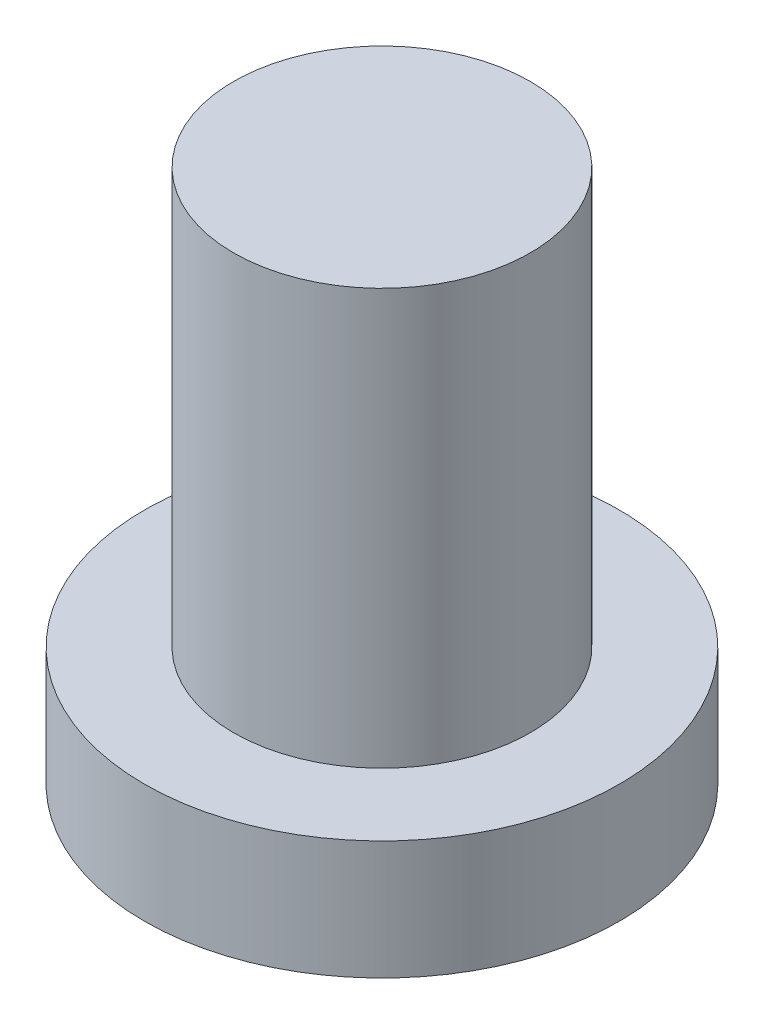
ISO-10303-21;
HEADER;
FILE_DESCRIPTION(('STEP AP214'),'2;1');
FILE_NAME('part.step','',(''),(''),'','','');
FILE_SCHEMA(('AUTOMOTIVE_DESIGN { 1 0 10303 214 1 1 1 1 }'));
ENDSEC;
DATA;
#1=APPLICATION_CONTEXT('core data for automotive mechanical design processes');
#2=APPLICATION_PROTOCOL_DEFINITION('international standard','automotive_design',2000,#1);
#3=PRODUCT_CONTEXT('',#1,'mechanical');
#4=PRODUCT('Part','Part','',(#3));
#5=PRODUCT_RELATED_PRODUCT_CATEGORY('part','',(#4));
#6=PRODUCT_DEFINITION_FORMATION('','',#4);
#7=PRODUCT_DEFINITION_CONTEXT('part definition',#1,'design');
#8=PRODUCT_DEFINITION('design','',#6,#7);
#9=PRODUCT_DEFINITION_SHAPE('','',#8);
#10=(LENGTH_UNIT() NAMED_UNIT(*) SI_UNIT(.MILLI.,.METRE.));
#11=(NAMED_UNIT(*) PLANE_ANGLE_UNIT() SI_UNIT($,.RADIAN.));
#12=(NAMED_UNIT(*) SI_UNIT($,.STERADIAN.) SOLID_ANGLE_UNIT());
#13=UNCERTAINTY_MEASURE_WITH_UNIT(LENGTH_MEASURE(1.E-05),#10,'distance_accuracy_value','');
#14=(GEOMETRIC_REPRESENTATION_CONTEXT(3) GLOBAL_UNCERTAINTY_ASSIGNED_CONTEXT((#13)) GLOBAL_UNIT_ASSIGNED_CONTEXT((#10,
#11,#12)) REPRESENTATION_CONTEXT('',''));
#15=CARTESIAN_POINT('',(0.,0.,0.));
#16=DIRECTION('',(0.,0.,1.));
#17=DIRECTION('',(1.,0.,0.));
#18=AXIS2_PLACEMENT_3D('',#15,#16,#17);
#19=CARTESIAN_POINT('',(2136.0000000012,625.499975958724,742.5));
#20=DIRECTION('',(0.,1.,1.60365119622746E-13));
#21=DIRECTION('',(0.,-1.60365119622746E-13,1.));
#22=AXIS2_PLACEMENT_3D('',#19,#20,#21);
#23=CYLINDRICAL_SURFACE('',#22,3.99999999881961);
#24=CARTESIAN_POINT('',(2136.0000000012,625.499987979711,742.5));
#25=DIRECTION('',(0.,1.,1.60365119622746E-13));
#26=DIRECTION('',(0.,-1.60365119622746E-13,1.));
#27=AXIS2_PLACEMENT_3D('',#24,#25,#26);
#28=CIRCLE('',#27,3.99999999881961);
#29=CARTESIAN_POINT('',(2136.0000000012,625.49998797971,746.49999999882));
#30=VERTEX_POINT('',#29);
#31=EDGE_CURVE('E43',#30,#30,#28,.T.);
#32=ORIENTED_EDGE('',*,*,#31,.T.);
#33=EDGE_LOOP('',(#32));
#34=FACE_BOUND('',#33,.T.);
#35=CARTESIAN_POINT('',(2136.0000000012,627.499987979723,742.5));
#36=DIRECTION('',(0.,1.,1.60365119622746E-13));
#37=DIRECTION('',(0.,-1.60365119622746E-13,1.));
#38=AXIS2_PLACEMENT_3D('',#35,#36,#37);
#39=CIRCLE('',#38,3.99999999881961);
#40=CARTESIAN_POINT('',(2136.0000000012,627.499987979722,746.49999999882));
#41=VERTEX_POINT('',#40);
#42=EDGE_CURVE('E10',#41,#41,#39,.T.);
#43=ORIENTED_EDGE('',*,*,#42,.F.);
#44=EDGE_LOOP('',(#43));
#45=FACE_BOUND('',#44,.T.);
#46=ADVANCED_FACE('F29',(#34,#45),#23,.T.);
#47=CARTESIAN_POINT('',(2138.5000000012,627.499987979723,742.5));
#48=DIRECTION('',(0.,1.,1.60365119622746E-13));
#49=DIRECTION('',(0.,-1.60365119622746E-13,1.));
#50=AXIS2_PLACEMENT_3D('',#47,#48,#49);
#51=PLANE('',#50);
#52=ORIENTED_EDGE('',*,*,#42,.T.);
#53=EDGE_LOOP('',(#52));
#54=FACE_BOUND('',#53,.T.);
#55=CARTESIAN_POINT('',(2136.0000000012,627.499987979723,742.5));
#56=DIRECTION('',(0.,1.,1.60365119622746E-13));
#57=DIRECTION('',(0.,-1.60365119622746E-13,1.));
#58=AXIS2_PLACEMENT_3D('',#55,#56,#57);
#59=CIRCLE('',#58,2.50000000000039);
#60=CARTESIAN_POINT('',(2136.0000000012,627.499987979722,745.000000000001));
#61=VERTEX_POINT('',#60);
#62=EDGE_CURVE('E35',#61,#61,#59,.T.);
#63=ORIENTED_EDGE('',*,*,#62,.F.);
#64=EDGE_LOOP('',(#63));
#65=FACE_BOUND('',#64,.T.);
#66=ADVANCED_FACE('F62',(#54,#65),#51,.T.);
#67=CARTESIAN_POINT('',(2136.0000000012,625.499975958724,742.5));
#68=DIRECTION('',(0.,1.,1.60365119622746E-13));
#69=DIRECTION('',(0.,-1.60365119622746E-13,1.));
#70=AXIS2_PLACEMENT_3D('',#67,#68,#69);
#71=CYLINDRICAL_SURFACE('',#70,2.50000000000039);
#72=ORIENTED_EDGE('',*,*,#62,.T.);
#73=EDGE_LOOP('',(#72));
#74=FACE_BOUND('',#73,.T.);
#75=CARTESIAN_POINT('',(2136.0000000012,634.499987979581,742.500000000002));
#76=DIRECTION('',(0.,1.,1.60365119622746E-13));
#77=DIRECTION('',(0.,-1.60365119622746E-13,1.));
#78=AXIS2_PLACEMENT_3D('',#75,#76,#77);
#79=CIRCLE('',#78,2.50000000000039);
#80=CARTESIAN_POINT('',(2136.0000000012,634.499987979581,745.000000000002));
#81=VERTEX_POINT('',#80);
#82=EDGE_CURVE('E39',#81,#81,#79,.T.);
#83=ORIENTED_EDGE('',*,*,#82,.F.);
#84=EDGE_LOOP('',(#83));
#85=FACE_BOUND('',#84,.T.);
#86=ADVANCED_FACE('F58',(#74,#85),#71,.T.);
#87=CARTESIAN_POINT('',(2136.0000000012,634.499987979581,742.500000000002));
#88=DIRECTION('',(0.,1.,1.60365119622746E-13));
#89=DIRECTION('',(0.,-1.60365119622746E-13,1.));
#90=AXIS2_PLACEMENT_3D('',#87,#88,#89);
#91=PLANE('',#90);
#92=ORIENTED_EDGE('',*,*,#82,.T.);
#93=EDGE_LOOP('',(#92));
#94=FACE_BOUND('',#93,.T.);
#95=ADVANCED_FACE('F53',(#94),#91,.T.);
#96=CARTESIAN_POINT('',(2140.00000000002,625.499987979711,742.5));
#97=DIRECTION('',(0.,-1.,-1.60365119622746E-13));
#98=DIRECTION('',(0.,1.60365119622746E-13,-1.));
#99=AXIS2_PLACEMENT_3D('',#96,#97,#98);
#100=PLANE('',#99);
#101=ORIENTED_EDGE('',*,*,#31,.F.);
#102=EDGE_LOOP('',(#101));
#103=FACE_BOUND('',#102,.T.);
#104=ADVANCED_FACE('F51',(#103),#100,.T.);
#105=CLOSED_SHELL('',(#46,#66,#86,#95,#104));
#106=MANIFOLD_SOLID_BREP('B2',#105);
#107=ADVANCED_BREP_SHAPE_REPRESENTATION('',(#18,#106),#14);
#108=SHAPE_DEFINITION_REPRESENTATION(#9,#107);
ENDSEC;
END-ISO-10303-21;
